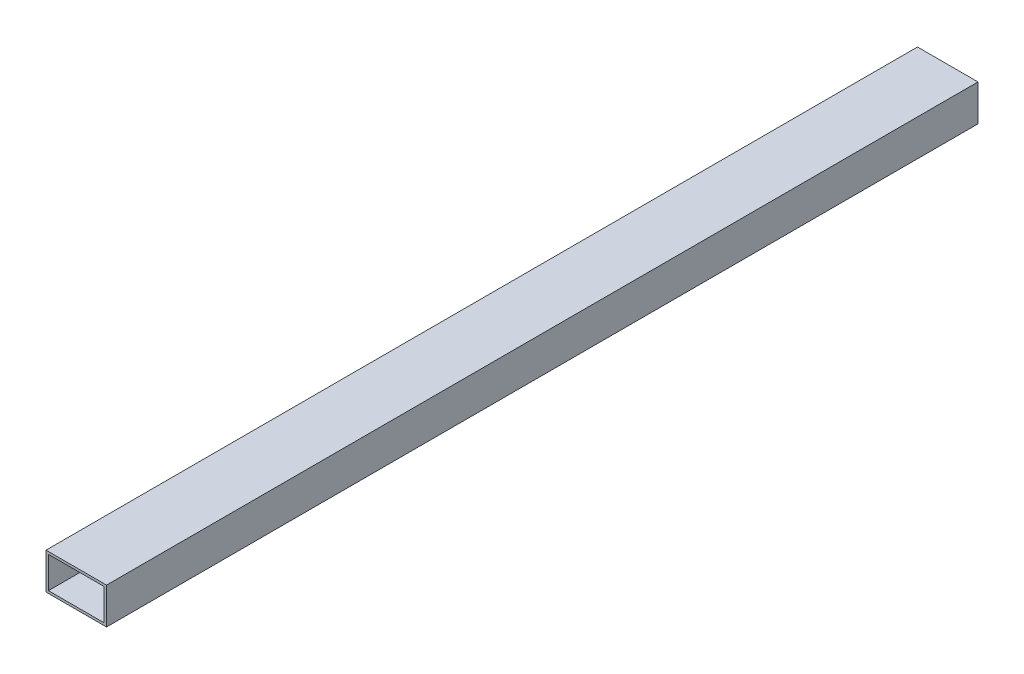
ISO-10303-21;
HEADER;
FILE_DESCRIPTION(('STEP AP214'),'2;1');
FILE_NAME('part.step','',(''),(''),'','','');
FILE_SCHEMA(('AUTOMOTIVE_DESIGN { 1 0 10303 214 1 1 1 1 }'));
ENDSEC;
DATA;
#1=APPLICATION_CONTEXT('core data for automotive mechanical design processes');
#2=APPLICATION_PROTOCOL_DEFINITION('international standard','automotive_design',2000,#1);
#3=PRODUCT_CONTEXT('',#1,'mechanical');
#4=PRODUCT('Part','Part','',(#3));
#5=PRODUCT_RELATED_PRODUCT_CATEGORY('part','',(#4));
#6=PRODUCT_DEFINITION_FORMATION('','',#4);
#7=PRODUCT_DEFINITION_CONTEXT('part definition',#1,'design');
#8=PRODUCT_DEFINITION('design','',#6,#7);
#9=PRODUCT_DEFINITION_SHAPE('','',#8);
#10=(LENGTH_UNIT() NAMED_UNIT(*) SI_UNIT(.MILLI.,.METRE.));
#11=(NAMED_UNIT(*) PLANE_ANGLE_UNIT() SI_UNIT($,.RADIAN.));
#12=(NAMED_UNIT(*) SI_UNIT($,.STERADIAN.) SOLID_ANGLE_UNIT());
#13=UNCERTAINTY_MEASURE_WITH_UNIT(LENGTH_MEASURE(1.E-05),#10,'distance_accuracy_value','');
#14=(GEOMETRIC_REPRESENTATION_CONTEXT(3) GLOBAL_UNCERTAINTY_ASSIGNED_CONTEXT((#13)) GLOBAL_UNIT_ASSIGNED_CONTEXT((#10,
#11,#12)) REPRESENTATION_CONTEXT('',''));
#15=CARTESIAN_POINT('',(0.,0.,0.));
#16=DIRECTION('',(0.,0.,1.));
#17=DIRECTION('',(1.,0.,0.));
#18=AXIS2_PLACEMENT_3D('',#15,#16,#17);
#19=CARTESIAN_POINT('',(0.,0.,360.));
#20=DIRECTION('',(0.,0.,1.));
#21=DIRECTION('',(1.,0.,0.));
#22=AXIS2_PLACEMENT_3D('',#19,#20,#21);
#23=PLANE('',#22);
#24=DIRECTION('',(0.,-1.,0.));
#25=VECTOR('',#24,1.);
#26=CARTESIAN_POINT('',(-25.,-15.,360.));
#27=LINE('',#26,#25);
#28=CARTESIAN_POINT('',(-25.,15.,360.));
#29=VERTEX_POINT('',#28);
#30=CARTESIAN_POINT('',(-25.,-15.,360.));
#31=VERTEX_POINT('',#30);
#32=EDGE_CURVE('E157',#29,#31,#27,.T.);
#33=ORIENTED_EDGE('',*,*,#32,.T.);
#34=DIRECTION('',(1.,0.,0.));
#35=VECTOR('',#34,1.);
#36=CARTESIAN_POINT('',(25.,-15.,360.));
#37=LINE('',#36,#35);
#38=CARTESIAN_POINT('',(25.,-15.,360.));
#39=VERTEX_POINT('',#38);
#40=EDGE_CURVE('E161',#31,#39,#37,.T.);
#41=ORIENTED_EDGE('',*,*,#40,.T.);
#42=DIRECTION('',(0.,1.,0.));
#43=VECTOR('',#42,1.);
#44=CARTESIAN_POINT('',(25.,-15.,360.));
#45=LINE('',#44,#43);
#46=CARTESIAN_POINT('',(25.,15.,360.));
#47=VERTEX_POINT('',#46);
#48=EDGE_CURVE('E165',#39,#47,#45,.T.);
#49=ORIENTED_EDGE('',*,*,#48,.T.);
#50=DIRECTION('',(-1.,0.,0.));
#51=VECTOR('',#50,1.);
#52=CARTESIAN_POINT('',(25.,15.,360.));
#53=LINE('',#52,#51);
#54=EDGE_CURVE('E168',#47,#29,#53,.T.);
#55=ORIENTED_EDGE('',*,*,#54,.T.);
#56=EDGE_LOOP('',(#33,#41,#49,#55));
#57=FACE_BOUND('',#56,.T.);
#58=DIRECTION('',(-1.,0.,0.));
#59=VECTOR('',#58,1.);
#60=CARTESIAN_POINT('',(23.,13.,360.));
#61=LINE('',#60,#59);
#62=CARTESIAN_POINT('',(23.,13.,360.));
#63=VERTEX_POINT('',#62);
#64=CARTESIAN_POINT('',(-23.,13.,360.));
#65=VERTEX_POINT('',#64);
#66=EDGE_CURVE('E118',#63,#65,#61,.T.);
#67=ORIENTED_EDGE('',*,*,#66,.F.);
#68=DIRECTION('',(0.,1.,0.));
#69=VECTOR('',#68,1.);
#70=CARTESIAN_POINT('',(23.,-13.,360.));
#71=LINE('',#70,#69);
#72=CARTESIAN_POINT('',(23.,-13.,360.));
#73=VERTEX_POINT('',#72);
#74=EDGE_CURVE('E109',#73,#63,#71,.T.);
#75=ORIENTED_EDGE('',*,*,#74,.F.);
#76=DIRECTION('',(1.,0.,0.));
#77=VECTOR('',#76,1.);
#78=CARTESIAN_POINT('',(23.,-13.,360.));
#79=LINE('',#78,#77);
#80=CARTESIAN_POINT('',(-23.,-13.,360.));
#81=VERTEX_POINT('',#80);
#82=EDGE_CURVE('E135',#81,#73,#79,.T.);
#83=ORIENTED_EDGE('',*,*,#82,.F.);
#84=DIRECTION('',(0.,-1.,0.));
#85=VECTOR('',#84,1.);
#86=CARTESIAN_POINT('',(-23.,-13.,360.));
#87=LINE('',#86,#85);
#88=EDGE_CURVE('E131',#65,#81,#87,.T.);
#89=ORIENTED_EDGE('',*,*,#88,.F.);
#90=EDGE_LOOP('',(#67,#75,#83,#89));
#91=FACE_BOUND('',#90,.T.);
#92=ADVANCED_FACE('F43',(#57,#91),#23,.T.);
#93=CARTESIAN_POINT('',(0.,0.,-360.));
#94=DIRECTION('',(0.,0.,1.));
#95=DIRECTION('',(1.,0.,0.));
#96=AXIS2_PLACEMENT_3D('',#93,#94,#95);
#97=PLANE('',#96);
#98=DIRECTION('',(0.,-1.,0.));
#99=VECTOR('',#98,1.);
#100=CARTESIAN_POINT('',(-25.,-15.,-360.));
#101=LINE('',#100,#99);
#102=CARTESIAN_POINT('',(-25.,15.,-360.));
#103=VERTEX_POINT('',#102);
#104=CARTESIAN_POINT('',(-25.,-15.,-360.));
#105=VERTEX_POINT('',#104);
#106=EDGE_CURVE('E127',#103,#105,#101,.T.);
#107=ORIENTED_EDGE('',*,*,#106,.F.);
#108=DIRECTION('',(-1.,0.,0.));
#109=VECTOR('',#108,1.);
#110=CARTESIAN_POINT('',(25.,15.,-360.));
#111=LINE('',#110,#109);
#112=CARTESIAN_POINT('',(25.,15.,-360.));
#113=VERTEX_POINT('',#112);
#114=EDGE_CURVE('E162',#113,#103,#111,.T.);
#115=ORIENTED_EDGE('',*,*,#114,.F.);
#116=DIRECTION('',(0.,1.,0.));
#117=VECTOR('',#116,1.);
#118=CARTESIAN_POINT('',(25.,-15.,-360.));
#119=LINE('',#118,#117);
#120=CARTESIAN_POINT('',(25.,-15.,-360.));
#121=VERTEX_POINT('',#120);
#122=EDGE_CURVE('E178',#121,#113,#119,.T.);
#123=ORIENTED_EDGE('',*,*,#122,.F.);
#124=DIRECTION('',(1.,0.,0.));
#125=VECTOR('',#124,1.);
#126=CARTESIAN_POINT('',(25.,-15.,-360.));
#127=LINE('',#126,#125);
#128=EDGE_CURVE('E175',#105,#121,#127,.T.);
#129=ORIENTED_EDGE('',*,*,#128,.F.);
#130=EDGE_LOOP('',(#107,#115,#123,#129));
#131=FACE_BOUND('',#130,.T.);
#132=DIRECTION('',(0.,1.,0.));
#133=VECTOR('',#132,1.);
#134=CARTESIAN_POINT('',(23.,-13.,-360.));
#135=LINE('',#134,#133);
#136=CARTESIAN_POINT('',(23.,-13.,-360.));
#137=VERTEX_POINT('',#136);
#138=CARTESIAN_POINT('',(23.,13.,-360.));
#139=VERTEX_POINT('',#138);
#140=EDGE_CURVE('E67',#137,#139,#135,.T.);
#141=ORIENTED_EDGE('',*,*,#140,.T.);
#142=DIRECTION('',(-1.,0.,0.));
#143=VECTOR('',#142,1.);
#144=CARTESIAN_POINT('',(23.,13.,-360.));
#145=LINE('',#144,#143);
#146=CARTESIAN_POINT('',(-23.,13.,-360.));
#147=VERTEX_POINT('',#146);
#148=EDGE_CURVE('E125',#139,#147,#145,.T.);
#149=ORIENTED_EDGE('',*,*,#148,.T.);
#150=DIRECTION('',(0.,-1.,0.));
#151=VECTOR('',#150,1.);
#152=CARTESIAN_POINT('',(-23.,-13.,-360.));
#153=LINE('',#152,#151);
#154=CARTESIAN_POINT('',(-23.,-13.,-360.));
#155=VERTEX_POINT('',#154);
#156=EDGE_CURVE('E144',#147,#155,#153,.T.);
#157=ORIENTED_EDGE('',*,*,#156,.T.);
#158=DIRECTION('',(1.,0.,0.));
#159=VECTOR('',#158,1.);
#160=CARTESIAN_POINT('',(23.,-13.,-360.));
#161=LINE('',#160,#159);
#162=EDGE_CURVE('E119',#155,#137,#161,.T.);
#163=ORIENTED_EDGE('',*,*,#162,.T.);
#164=EDGE_LOOP('',(#141,#149,#157,#163));
#165=FACE_BOUND('',#164,.T.);
#166=ADVANCED_FACE('F201',(#131,#165),#97,.F.);
#167=CARTESIAN_POINT('',(-25.,-15.,360.));
#168=DIRECTION('',(1.,0.,0.));
#169=DIRECTION('',(0.,1.,0.));
#170=AXIS2_PLACEMENT_3D('',#167,#168,#169);
#171=PLANE('',#170);
#172=ORIENTED_EDGE('',*,*,#106,.T.);
#173=DIRECTION('',(0.,0.,-1.));
#174=VECTOR('',#173,1.);
#175=CARTESIAN_POINT('',(-25.,-15.,360.));
#176=LINE('',#175,#174);
#177=EDGE_CURVE('E11',#31,#105,#176,.T.);
#178=ORIENTED_EDGE('',*,*,#177,.F.);
#179=ORIENTED_EDGE('',*,*,#32,.F.);
#180=DIRECTION('',(0.,0.,-1.));
#181=VECTOR('',#180,1.);
#182=CARTESIAN_POINT('',(-25.,15.,360.));
#183=LINE('',#182,#181);
#184=EDGE_CURVE('E171',#29,#103,#183,.T.);
#185=ORIENTED_EDGE('',*,*,#184,.T.);
#186=EDGE_LOOP('',(#172,#178,#179,#185));
#187=FACE_BOUND('',#186,.T.);
#188=ADVANCED_FACE('F45',(#187),#171,.F.);
#189=CARTESIAN_POINT('',(25.,-15.,360.));
#190=DIRECTION('',(0.,1.,0.));
#191=DIRECTION('',(-1.,0.,0.));
#192=AXIS2_PLACEMENT_3D('',#189,#190,#191);
#193=PLANE('',#192);
#194=ORIENTED_EDGE('',*,*,#128,.T.);
#195=DIRECTION('',(0.,0.,-1.));
#196=VECTOR('',#195,1.);
#197=CARTESIAN_POINT('',(25.,-15.,360.));
#198=LINE('',#197,#196);
#199=EDGE_CURVE('E52',#39,#121,#198,.T.);
#200=ORIENTED_EDGE('',*,*,#199,.F.);
#201=ORIENTED_EDGE('',*,*,#40,.F.);
#202=ORIENTED_EDGE('',*,*,#177,.T.);
#203=EDGE_LOOP('',(#194,#200,#201,#202));
#204=FACE_BOUND('',#203,.T.);
#205=ADVANCED_FACE('F211',(#204),#193,.F.);
#206=CARTESIAN_POINT('',(25.,-15.,360.));
#207=DIRECTION('',(-1.,0.,0.));
#208=DIRECTION('',(0.,0.,1.));
#209=AXIS2_PLACEMENT_3D('',#206,#207,#208);
#210=PLANE('',#209);
#211=ORIENTED_EDGE('',*,*,#122,.T.);
#212=DIRECTION('',(0.,0.,-1.));
#213=VECTOR('',#212,1.);
#214=CARTESIAN_POINT('',(25.,15.,360.));
#215=LINE('',#214,#213);
#216=EDGE_CURVE('E186',#47,#113,#215,.T.);
#217=ORIENTED_EDGE('',*,*,#216,.F.);
#218=ORIENTED_EDGE('',*,*,#48,.F.);
#219=ORIENTED_EDGE('',*,*,#199,.T.);
#220=EDGE_LOOP('',(#211,#217,#218,#219));
#221=FACE_BOUND('',#220,.T.);
#222=ADVANCED_FACE('F195',(#221),#210,.F.);
#223=CARTESIAN_POINT('',(25.,15.,360.));
#224=DIRECTION('',(0.,-1.,0.));
#225=DIRECTION('',(1.,0.,0.));
#226=AXIS2_PLACEMENT_3D('',#223,#224,#225);
#227=PLANE('',#226);
#228=ORIENTED_EDGE('',*,*,#114,.T.);
#229=ORIENTED_EDGE('',*,*,#184,.F.);
#230=ORIENTED_EDGE('',*,*,#54,.F.);
#231=ORIENTED_EDGE('',*,*,#216,.T.);
#232=EDGE_LOOP('',(#228,#229,#230,#231));
#233=FACE_BOUND('',#232,.T.);
#234=ADVANCED_FACE('F205',(#233),#227,.F.);
#235=CARTESIAN_POINT('',(23.,-13.,360.));
#236=DIRECTION('',(-1.,0.,0.));
#237=DIRECTION('',(0.,0.,1.));
#238=AXIS2_PLACEMENT_3D('',#235,#236,#237);
#239=PLANE('',#238);
#240=ORIENTED_EDGE('',*,*,#140,.F.);
#241=DIRECTION('',(0.,0.,-1.));
#242=VECTOR('',#241,1.);
#243=CARTESIAN_POINT('',(23.,-13.,360.));
#244=LINE('',#243,#242);
#245=EDGE_CURVE('E113',#73,#137,#244,.T.);
#246=ORIENTED_EDGE('',*,*,#245,.F.);
#247=ORIENTED_EDGE('',*,*,#74,.T.);
#248=DIRECTION('',(0.,0.,-1.));
#249=VECTOR('',#248,1.);
#250=CARTESIAN_POINT('',(23.,13.,360.));
#251=LINE('',#250,#249);
#252=EDGE_CURVE('E112',#63,#139,#251,.T.);
#253=ORIENTED_EDGE('',*,*,#252,.T.);
#254=EDGE_LOOP('',(#240,#246,#247,#253));
#255=FACE_BOUND('',#254,.T.);
#256=ADVANCED_FACE('F111',(#255),#239,.T.);
#257=CARTESIAN_POINT('',(23.,13.,360.));
#258=DIRECTION('',(0.,-1.,0.));
#259=DIRECTION('',(1.,0.,0.));
#260=AXIS2_PLACEMENT_3D('',#257,#258,#259);
#261=PLANE('',#260);
#262=ORIENTED_EDGE('',*,*,#148,.F.);
#263=ORIENTED_EDGE('',*,*,#252,.F.);
#264=ORIENTED_EDGE('',*,*,#66,.T.);
#265=DIRECTION('',(0.,0.,-1.));
#266=VECTOR('',#265,1.);
#267=CARTESIAN_POINT('',(-23.,13.,360.));
#268=LINE('',#267,#266);
#269=EDGE_CURVE('E128',#65,#147,#268,.T.);
#270=ORIENTED_EDGE('',*,*,#269,.T.);
#271=EDGE_LOOP('',(#262,#263,#264,#270));
#272=FACE_BOUND('',#271,.T.);
#273=ADVANCED_FACE('F122',(#272),#261,.T.);
#274=CARTESIAN_POINT('',(-23.,-13.,360.));
#275=DIRECTION('',(1.,0.,0.));
#276=DIRECTION('',(0.,0.,-1.));
#277=AXIS2_PLACEMENT_3D('',#274,#275,#276);
#278=PLANE('',#277);
#279=ORIENTED_EDGE('',*,*,#156,.F.);
#280=ORIENTED_EDGE('',*,*,#269,.F.);
#281=ORIENTED_EDGE('',*,*,#88,.T.);
#282=DIRECTION('',(0.,0.,-1.));
#283=VECTOR('',#282,1.);
#284=CARTESIAN_POINT('',(-23.,-13.,360.));
#285=LINE('',#284,#283);
#286=EDGE_CURVE('E59',#81,#155,#285,.T.);
#287=ORIENTED_EDGE('',*,*,#286,.T.);
#288=EDGE_LOOP('',(#279,#280,#281,#287));
#289=FACE_BOUND('',#288,.T.);
#290=ADVANCED_FACE('F234',(#289),#278,.T.);
#291=CARTESIAN_POINT('',(23.,-13.,360.));
#292=DIRECTION('',(0.,1.,0.));
#293=DIRECTION('',(0.,0.,1.));
#294=AXIS2_PLACEMENT_3D('',#291,#292,#293);
#295=PLANE('',#294);
#296=ORIENTED_EDGE('',*,*,#162,.F.);
#297=ORIENTED_EDGE('',*,*,#286,.F.);
#298=ORIENTED_EDGE('',*,*,#82,.T.);
#299=ORIENTED_EDGE('',*,*,#245,.T.);
#300=EDGE_LOOP('',(#296,#297,#298,#299));
#301=FACE_BOUND('',#300,.T.);
#302=ADVANCED_FACE('F238',(#301),#295,.T.);
#303=CLOSED_SHELL('',(#92,#166,#188,#205,#222,#234,#256,#273,#290,#302));
#304=MANIFOLD_SOLID_BREP('B2',#303);
#305=ADVANCED_BREP_SHAPE_REPRESENTATION('',(#18,#304),#14);
#306=SHAPE_DEFINITION_REPRESENTATION(#9,#305);
ENDSEC;
END-ISO-10303-21;
